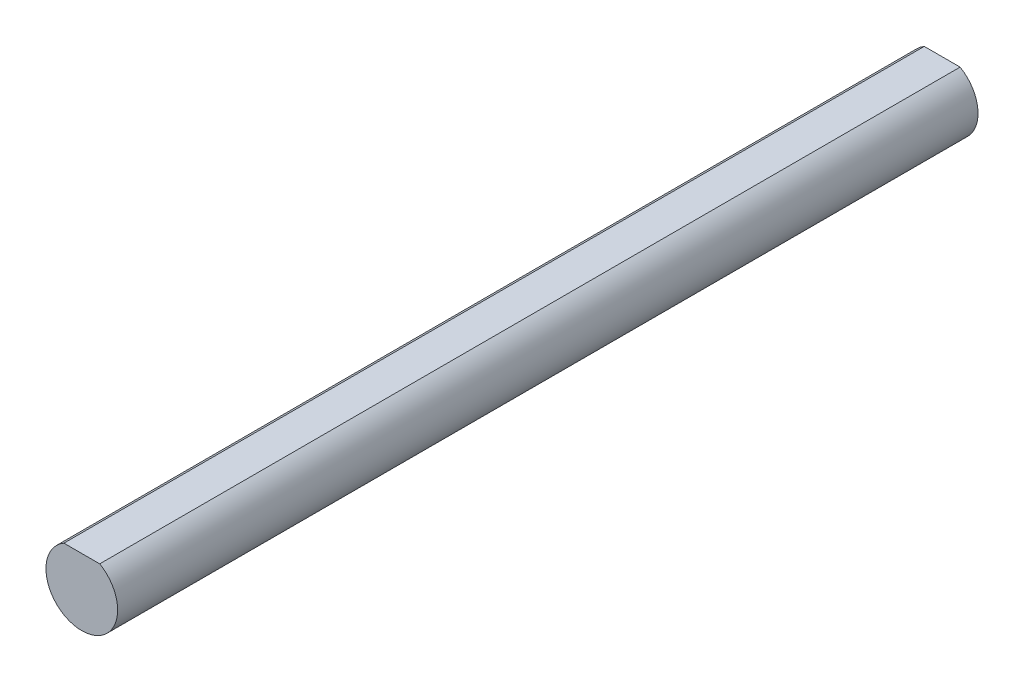
ISO-10303-21;
HEADER;
FILE_DESCRIPTION(('STEP AP214'),'2;1');
FILE_NAME('part.step','',(''),(''),'','','');
FILE_SCHEMA(('AUTOMOTIVE_DESIGN { 1 0 10303 214 1 1 1 1 }'));
ENDSEC;
DATA;
#1=APPLICATION_CONTEXT('core data for automotive mechanical design processes');
#2=APPLICATION_PROTOCOL_DEFINITION('international standard','automotive_design',2000,#1);
#3=PRODUCT_CONTEXT('',#1,'mechanical');
#4=PRODUCT('Part','Part','',(#3));
#5=PRODUCT_RELATED_PRODUCT_CATEGORY('part','',(#4));
#6=PRODUCT_DEFINITION_FORMATION('','',#4);
#7=PRODUCT_DEFINITION_CONTEXT('part definition',#1,'design');
#8=PRODUCT_DEFINITION('design','',#6,#7);
#9=PRODUCT_DEFINITION_SHAPE('','',#8);
#10=(LENGTH_UNIT() NAMED_UNIT(*) SI_UNIT(.MILLI.,.METRE.));
#11=(NAMED_UNIT(*) PLANE_ANGLE_UNIT() SI_UNIT($,.RADIAN.));
#12=(NAMED_UNIT(*) SI_UNIT($,.STERADIAN.) SOLID_ANGLE_UNIT());
#13=UNCERTAINTY_MEASURE_WITH_UNIT(LENGTH_MEASURE(1.E-05),#10,'distance_accuracy_value','');
#14=(GEOMETRIC_REPRESENTATION_CONTEXT(3) GLOBAL_UNCERTAINTY_ASSIGNED_CONTEXT((#13)) GLOBAL_UNIT_ASSIGNED_CONTEXT((#10,
#11,#12)) REPRESENTATION_CONTEXT('',''));
#15=CARTESIAN_POINT('',(0.,0.,0.));
#16=DIRECTION('',(0.,0.,1.));
#17=DIRECTION('',(1.,0.,0.));
#18=AXIS2_PLACEMENT_3D('',#15,#16,#17);
#19=CARTESIAN_POINT('',(0.,0.,38.1));
#20=DIRECTION('',(0.,0.,-1.));
#21=DIRECTION('',(-1.,0.,0.));
#22=AXIS2_PLACEMENT_3D('',#19,#20,#21);
#23=CYLINDRICAL_SURFACE('',#22,3.175);
#24=CARTESIAN_POINT('',(0.,0.,-38.1));
#25=DIRECTION('',(0.,0.,1.));
#26=DIRECTION('',(1.,0.,0.));
#27=AXIS2_PLACEMENT_3D('',#24,#25,#26);
#28=CIRCLE('',#27,3.175);
#29=CARTESIAN_POINT('',(-1.5875,2.74963065701559,-38.1));
#30=VERTEX_POINT('',#29);
#31=CARTESIAN_POINT('',(1.5875,2.74963065701559,-38.1));
#32=VERTEX_POINT('',#31);
#33=EDGE_CURVE('E64',#30,#32,#28,.T.);
#34=ORIENTED_EDGE('',*,*,#33,.T.);
#35=DIRECTION('',(0.,0.,-1.));
#36=VECTOR('',#35,1.);
#37=CARTESIAN_POINT('',(1.5875,2.74963065701559,38.1));
#38=LINE('',#37,#36);
#39=CARTESIAN_POINT('',(1.5875,2.74963065701559,38.1));
#40=VERTEX_POINT('',#39);
#41=EDGE_CURVE('E11',#40,#32,#38,.T.);
#42=ORIENTED_EDGE('',*,*,#41,.F.);
#43=CARTESIAN_POINT('',(0.,0.,38.1));
#44=DIRECTION('',(0.,0.,1.));
#45=DIRECTION('',(1.,0.,0.));
#46=AXIS2_PLACEMENT_3D('',#43,#44,#45);
#47=CIRCLE('',#46,3.175);
#48=CARTESIAN_POINT('',(-1.5875,2.74963065701559,38.1));
#49=VERTEX_POINT('',#48);
#50=EDGE_CURVE('E63',#49,#40,#47,.T.);
#51=ORIENTED_EDGE('',*,*,#50,.F.);
#52=DIRECTION('',(0.,0.,-1.));
#53=VECTOR('',#52,1.);
#54=CARTESIAN_POINT('',(-1.5875,2.74963065701559,38.1));
#55=LINE('',#54,#53);
#56=EDGE_CURVE('E41',#49,#30,#55,.T.);
#57=ORIENTED_EDGE('',*,*,#56,.T.);
#58=EDGE_LOOP('',(#34,#42,#51,#57));
#59=FACE_BOUND('',#58,.T.);
#60=ADVANCED_FACE('F33',(#59),#23,.T.);
#61=CARTESIAN_POINT('',(-1.5875,2.74963065701559,38.1));
#62=DIRECTION('',(0.,-1.,0.));
#63=DIRECTION('',(0.,0.,-1.));
#64=AXIS2_PLACEMENT_3D('',#61,#62,#63);
#65=PLANE('',#64);
#66=DIRECTION('',(-1.,0.,0.));
#67=VECTOR('',#66,1.);
#68=CARTESIAN_POINT('',(-1.5875,2.74963065701559,-38.1));
#69=LINE('',#68,#67);
#70=EDGE_CURVE('E56',#32,#30,#69,.T.);
#71=ORIENTED_EDGE('',*,*,#70,.T.);
#72=ORIENTED_EDGE('',*,*,#56,.F.);
#73=DIRECTION('',(-1.,0.,0.));
#74=VECTOR('',#73,1.);
#75=CARTESIAN_POINT('',(-1.5875,2.74963065701559,38.1));
#76=LINE('',#75,#74);
#77=EDGE_CURVE('E48',#40,#49,#76,.T.);
#78=ORIENTED_EDGE('',*,*,#77,.F.);
#79=ORIENTED_EDGE('',*,*,#41,.T.);
#80=EDGE_LOOP('',(#71,#72,#78,#79));
#81=FACE_BOUND('',#80,.T.);
#82=ADVANCED_FACE('F59',(#81),#65,.F.);
#83=CARTESIAN_POINT('',(0.,0.,38.1));
#84=DIRECTION('',(0.,0.,1.));
#85=DIRECTION('',(1.,0.,0.));
#86=AXIS2_PLACEMENT_3D('',#83,#84,#85);
#87=PLANE('',#86);
#88=ORIENTED_EDGE('',*,*,#50,.T.);
#89=ORIENTED_EDGE('',*,*,#77,.T.);
#90=EDGE_LOOP('',(#88,#89));
#91=FACE_BOUND('',#90,.T.);
#92=ADVANCED_FACE('F71',(#91),#87,.T.);
#93=CARTESIAN_POINT('',(0.,0.,-38.1));
#94=DIRECTION('',(0.,0.,1.));
#95=DIRECTION('',(1.,0.,0.));
#96=AXIS2_PLACEMENT_3D('',#93,#94,#95);
#97=PLANE('',#96);
#98=ORIENTED_EDGE('',*,*,#33,.F.);
#99=ORIENTED_EDGE('',*,*,#70,.F.);
#100=EDGE_LOOP('',(#98,#99));
#101=FACE_BOUND('',#100,.T.);
#102=ADVANCED_FACE('F67',(#101),#97,.F.);
#103=CLOSED_SHELL('',(#60,#82,#92,#102));
#104=MANIFOLD_SOLID_BREP('B2',#103);
#105=ADVANCED_BREP_SHAPE_REPRESENTATION('',(#18,#104),#14);
#106=SHAPE_DEFINITION_REPRESENTATION(#9,#105);
ENDSEC;
END-ISO-10303-21;
